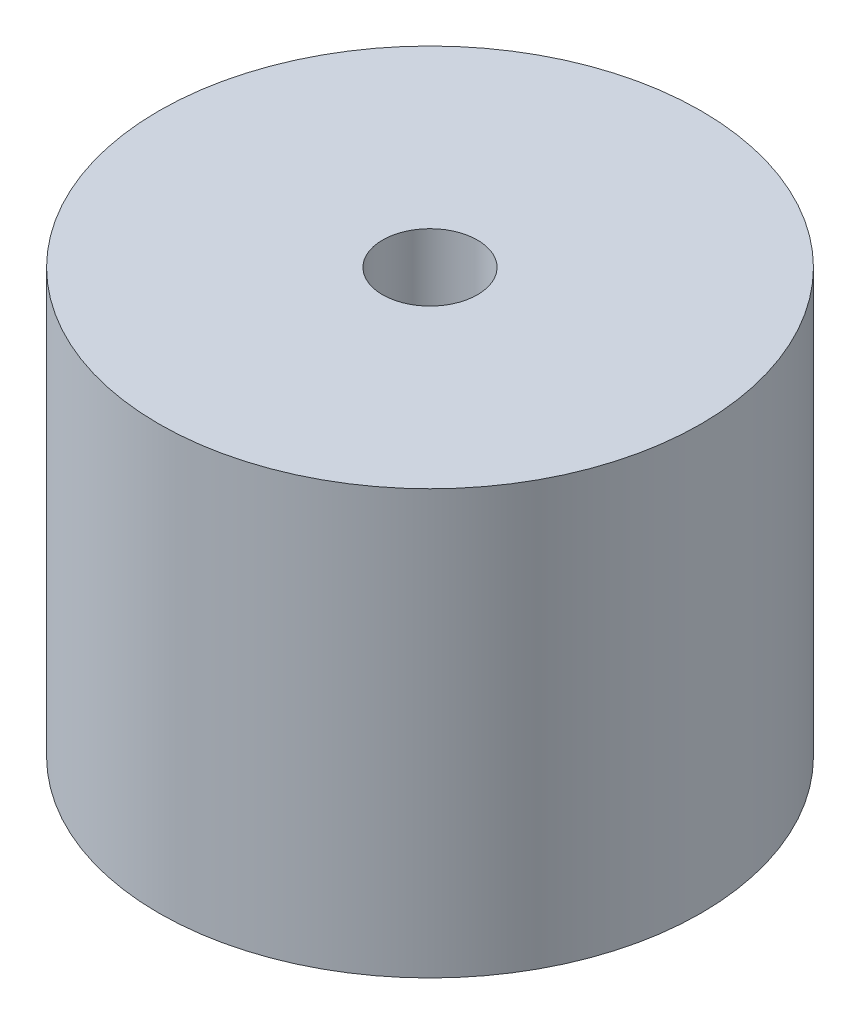
ISO-10303-21;
HEADER;
FILE_DESCRIPTION(('STEP AP214'),'2;1');
FILE_NAME('part.step','',(''),(''),'','','');
FILE_SCHEMA(('AUTOMOTIVE_DESIGN { 1 0 10303 214 1 1 1 1 }'));
ENDSEC;
DATA;
#1=APPLICATION_CONTEXT('core data for automotive mechanical design processes');
#2=APPLICATION_PROTOCOL_DEFINITION('international standard','automotive_design',2000,#1);
#3=PRODUCT_CONTEXT('',#1,'mechanical');
#4=PRODUCT('Part','Part','',(#3));
#5=PRODUCT_RELATED_PRODUCT_CATEGORY('part','',(#4));
#6=PRODUCT_DEFINITION_FORMATION('','',#4);
#7=PRODUCT_DEFINITION_CONTEXT('part definition',#1,'design');
#8=PRODUCT_DEFINITION('design','',#6,#7);
#9=PRODUCT_DEFINITION_SHAPE('','',#8);
#10=(LENGTH_UNIT() NAMED_UNIT(*) SI_UNIT(.MILLI.,.METRE.));
#11=(NAMED_UNIT(*) PLANE_ANGLE_UNIT() SI_UNIT($,.RADIAN.));
#12=(NAMED_UNIT(*) SI_UNIT($,.STERADIAN.) SOLID_ANGLE_UNIT());
#13=UNCERTAINTY_MEASURE_WITH_UNIT(LENGTH_MEASURE(1.E-05),#10,'distance_accuracy_value','');
#14=(GEOMETRIC_REPRESENTATION_CONTEXT(3) GLOBAL_UNCERTAINTY_ASSIGNED_CONTEXT((#13)) GLOBAL_UNIT_ASSIGNED_CONTEXT((#10,
#11,#12)) REPRESENTATION_CONTEXT('',''));
#15=CARTESIAN_POINT('',(0.,0.,0.));
#16=DIRECTION('',(0.,0.,1.));
#17=DIRECTION('',(1.,0.,0.));
#18=AXIS2_PLACEMENT_3D('',#15,#16,#17);
#19=CARTESIAN_POINT('',(0.,-25.,0.));
#20=DIRECTION('',(0.,1.,0.));
#21=DIRECTION('',(0.,0.,1.));
#22=AXIS2_PLACEMENT_3D('',#19,#20,#21);
#23=CYLINDRICAL_SURFACE('',#22,2.8);
#24=CARTESIAN_POINT('',(0.,-25.,0.));
#25=DIRECTION('',(0.,1.,0.));
#26=DIRECTION('',(0.,0.,1.));
#27=AXIS2_PLACEMENT_3D('',#24,#25,#26);
#28=CIRCLE('',#27,2.8);
#29=CARTESIAN_POINT('',(0.,-25.,2.8));
#30=VERTEX_POINT('',#29);
#31=EDGE_CURVE('E47',#30,#30,#28,.T.);
#32=ORIENTED_EDGE('',*,*,#31,.F.);
#33=EDGE_LOOP('',(#32));
#34=FACE_BOUND('',#33,.T.);
#35=CARTESIAN_POINT('',(0.,0.,0.));
#36=DIRECTION('',(0.,1.,0.));
#37=DIRECTION('',(0.,0.,1.));
#38=AXIS2_PLACEMENT_3D('',#35,#36,#37);
#39=CIRCLE('',#38,2.8);
#40=CARTESIAN_POINT('',(0.,0.,2.8));
#41=VERTEX_POINT('',#40);
#42=EDGE_CURVE('E54',#41,#41,#39,.T.);
#43=ORIENTED_EDGE('',*,*,#42,.T.);
#44=EDGE_LOOP('',(#43));
#45=FACE_BOUND('',#44,.T.);
#46=ADVANCED_FACE('F39',(#34,#45),#23,.F.);
#47=CARTESIAN_POINT('',(0.,-25.,0.));
#48=DIRECTION('',(0.,1.,0.));
#49=DIRECTION('',(0.,0.,1.));
#50=AXIS2_PLACEMENT_3D('',#47,#48,#49);
#51=CYLINDRICAL_SURFACE('',#50,16.);
#52=CARTESIAN_POINT('',(0.,-25.,0.));
#53=DIRECTION('',(0.,1.,0.));
#54=DIRECTION('',(0.,0.,1.));
#55=AXIS2_PLACEMENT_3D('',#52,#53,#54);
#56=CIRCLE('',#55,16.);
#57=CARTESIAN_POINT('',(0.,-25.,16.));
#58=VERTEX_POINT('',#57);
#59=EDGE_CURVE('E10',#58,#58,#56,.T.);
#60=ORIENTED_EDGE('',*,*,#59,.T.);
#61=EDGE_LOOP('',(#60));
#62=FACE_BOUND('',#61,.T.);
#63=CARTESIAN_POINT('',(0.,0.,0.));
#64=DIRECTION('',(0.,1.,0.));
#65=DIRECTION('',(0.,0.,1.));
#66=AXIS2_PLACEMENT_3D('',#63,#64,#65);
#67=CIRCLE('',#66,16.);
#68=CARTESIAN_POINT('',(0.,0.,16.));
#69=VERTEX_POINT('',#68);
#70=EDGE_CURVE('E42',#69,#69,#67,.T.);
#71=ORIENTED_EDGE('',*,*,#70,.F.);
#72=EDGE_LOOP('',(#71));
#73=FACE_BOUND('',#72,.T.);
#74=ADVANCED_FACE('F65',(#62,#73),#51,.T.);
#75=CARTESIAN_POINT('',(0.,-25.,0.));
#76=DIRECTION('',(0.,1.,0.));
#77=DIRECTION('',(0.,0.,1.));
#78=AXIS2_PLACEMENT_3D('',#75,#76,#77);
#79=PLANE('',#78);
#80=ORIENTED_EDGE('',*,*,#31,.T.);
#81=EDGE_LOOP('',(#80));
#82=FACE_BOUND('',#81,.T.);
#83=ORIENTED_EDGE('',*,*,#59,.F.);
#84=EDGE_LOOP('',(#83));
#85=FACE_BOUND('',#84,.T.);
#86=ADVANCED_FACE('F67',(#82,#85),#79,.F.);
#87=CARTESIAN_POINT('',(0.,0.,0.));
#88=DIRECTION('',(0.,1.,0.));
#89=DIRECTION('',(0.,0.,1.));
#90=AXIS2_PLACEMENT_3D('',#87,#88,#89);
#91=PLANE('',#90);
#92=ORIENTED_EDGE('',*,*,#42,.F.);
#93=EDGE_LOOP('',(#92));
#94=FACE_BOUND('',#93,.T.);
#95=ORIENTED_EDGE('',*,*,#70,.T.);
#96=EDGE_LOOP('',(#95));
#97=FACE_BOUND('',#96,.T.);
#98=ADVANCED_FACE('F63',(#94,#97),#91,.T.);
#99=CLOSED_SHELL('',(#46,#74,#86,#98));
#100=MANIFOLD_SOLID_BREP('B2',#99);
#101=ADVANCED_BREP_SHAPE_REPRESENTATION('',(#18,#100),#14);
#102=SHAPE_DEFINITION_REPRESENTATION(#9,#101);
ENDSEC;
END-ISO-10303-21;
